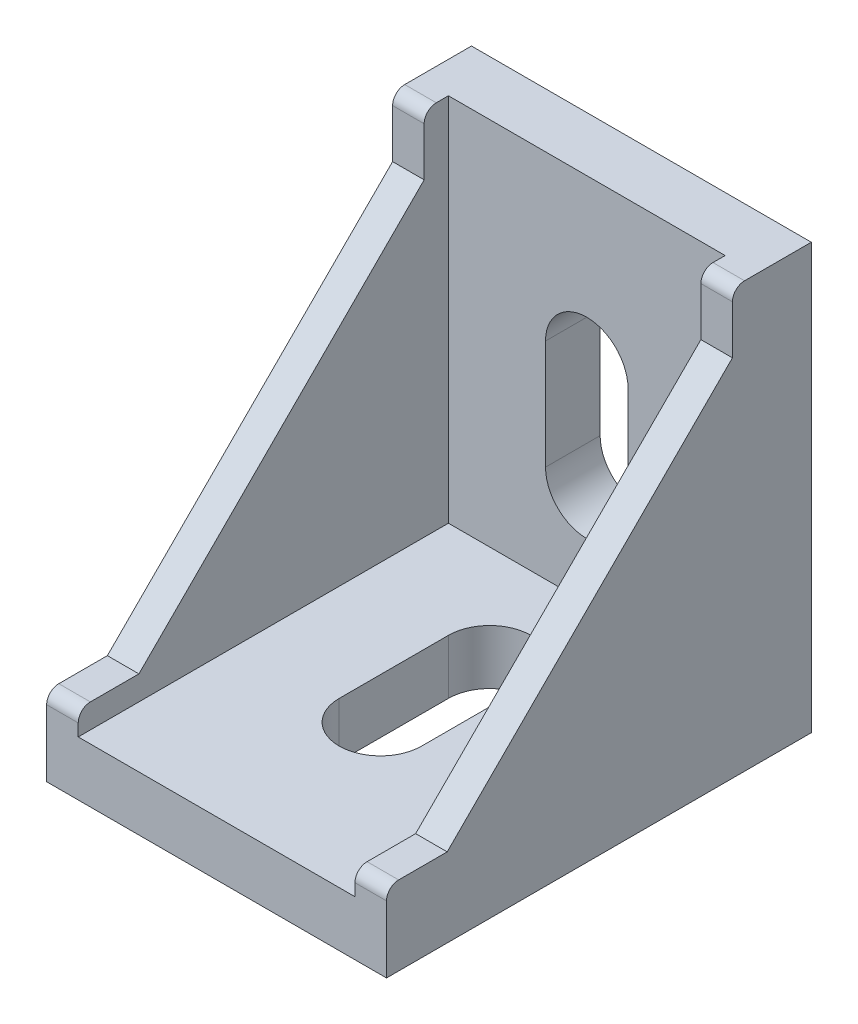
ISO-10303-21;
HEADER;
FILE_DESCRIPTION(('STEP AP214'),'2;1');
FILE_NAME('part.step','',(''),(''),'','','');
FILE_SCHEMA(('AUTOMOTIVE_DESIGN { 1 0 10303 214 1 1 1 1 }'));
ENDSEC;
DATA;
#1=APPLICATION_CONTEXT('core data for automotive mechanical design processes');
#2=APPLICATION_PROTOCOL_DEFINITION('international standard','automotive_design',2000,#1);
#3=PRODUCT_CONTEXT('',#1,'mechanical');
#4=PRODUCT('Part','Part','',(#3));
#5=PRODUCT_RELATED_PRODUCT_CATEGORY('part','',(#4));
#6=PRODUCT_DEFINITION_FORMATION('','',#4);
#7=PRODUCT_DEFINITION_CONTEXT('part definition',#1,'design');
#8=PRODUCT_DEFINITION('design','',#6,#7);
#9=PRODUCT_DEFINITION_SHAPE('','',#8);
#10=(LENGTH_UNIT() NAMED_UNIT(*) SI_UNIT(.MILLI.,.METRE.));
#11=(NAMED_UNIT(*) PLANE_ANGLE_UNIT() SI_UNIT($,.RADIAN.));
#12=(NAMED_UNIT(*) SI_UNIT($,.STERADIAN.) SOLID_ANGLE_UNIT());
#13=UNCERTAINTY_MEASURE_WITH_UNIT(LENGTH_MEASURE(1.E-05),#10,'distance_accuracy_value','');
#14=(GEOMETRIC_REPRESENTATION_CONTEXT(3) GLOBAL_UNCERTAINTY_ASSIGNED_CONTEXT((#13)) GLOBAL_UNIT_ASSIGNED_CONTEXT((#10,
#11,#12)) REPRESENTATION_CONTEXT('',''));
#15=CARTESIAN_POINT('',(0.,0.,0.));
#16=DIRECTION('',(0.,0.,1.));
#17=DIRECTION('',(1.,0.,0.));
#18=AXIS2_PLACEMENT_3D('',#15,#16,#17);
#19=CARTESIAN_POINT('',(14.,17.5,4.5));
#20=DIRECTION('',(0.,0.,-1.));
#21=DIRECTION('',(-1.,0.,0.));
#22=AXIS2_PLACEMENT_3D('',#19,#20,#21);
#23=PLANE('',#22);
#24=DIRECTION('',(0.,1.,0.));
#25=VECTOR('',#24,1.);
#26=CARTESIAN_POINT('',(3.4,-5.,4.5));
#27=LINE('',#26,#25);
#28=CARTESIAN_POINT('',(3.4,-5.,4.5));
#29=VERTEX_POINT('',#28);
#30=CARTESIAN_POINT('',(3.4,4.,4.5));
#31=VERTEX_POINT('',#30);
#32=EDGE_CURVE('E268',#29,#31,#27,.T.);
#33=ORIENTED_EDGE('',*,*,#32,.F.);
#34=CARTESIAN_POINT('',(0.,-5.,4.5));
#35=DIRECTION('',(0.,0.,1.));
#36=DIRECTION('',(1.,0.,0.));
#37=AXIS2_PLACEMENT_3D('',#34,#35,#36);
#38=CIRCLE('',#37,3.4);
#39=CARTESIAN_POINT('',(-3.4,-5.,4.5));
#40=VERTEX_POINT('',#39);
#41=EDGE_CURVE('E249',#40,#29,#38,.T.);
#42=ORIENTED_EDGE('',*,*,#41,.F.);
#43=DIRECTION('',(0.,-1.,0.));
#44=VECTOR('',#43,1.);
#45=CARTESIAN_POINT('',(-3.4,-5.,4.5));
#46=LINE('',#45,#44);
#47=CARTESIAN_POINT('',(-3.4,4.,4.5));
#48=VERTEX_POINT('',#47);
#49=EDGE_CURVE('E257',#48,#40,#46,.T.);
#50=ORIENTED_EDGE('',*,*,#49,.F.);
#51=CARTESIAN_POINT('',(0.,4.,4.5));
#52=DIRECTION('',(0.,0.,1.));
#53=DIRECTION('',(1.,0.,0.));
#54=AXIS2_PLACEMENT_3D('',#51,#52,#53);
#55=CIRCLE('',#54,3.4);
#56=EDGE_CURVE('E271',#31,#48,#55,.T.);
#57=ORIENTED_EDGE('',*,*,#56,.F.);
#58=EDGE_LOOP('',(#33,#42,#50,#57));
#59=FACE_BOUND('',#58,.T.);
#60=DIRECTION('',(0.,-1.,0.));
#61=VECTOR('',#60,1.);
#62=CARTESIAN_POINT('',(11.4,17.5,4.5));
#63=LINE('',#62,#61);
#64=CARTESIAN_POINT('',(11.4,17.5,4.5));
#65=VERTEX_POINT('',#64);
#66=CARTESIAN_POINT('',(11.4,-13.,4.5));
#67=VERTEX_POINT('',#66);
#68=EDGE_CURVE('E285',#65,#67,#63,.T.);
#69=ORIENTED_EDGE('',*,*,#68,.F.);
#70=DIRECTION('',(-1.,0.,0.));
#71=VECTOR('',#70,1.);
#72=CARTESIAN_POINT('',(-14.,17.5,4.5));
#73=LINE('',#72,#71);
#74=CARTESIAN_POINT('',(-11.4,17.5,4.5));
#75=VERTEX_POINT('',#74);
#76=EDGE_CURVE('E357',#65,#75,#73,.T.);
#77=ORIENTED_EDGE('',*,*,#76,.T.);
#78=DIRECTION('',(0.,-1.,0.));
#79=VECTOR('',#78,1.);
#80=CARTESIAN_POINT('',(-11.4,17.5,4.5));
#81=LINE('',#80,#79);
#82=CARTESIAN_POINT('',(-11.4,-13.,4.5));
#83=VERTEX_POINT('',#82);
#84=EDGE_CURVE('E313',#75,#83,#81,.T.);
#85=ORIENTED_EDGE('',*,*,#84,.T.);
#86=DIRECTION('',(1.,0.,0.));
#87=VECTOR('',#86,1.);
#88=CARTESIAN_POINT('',(14.,-13.,4.5));
#89=LINE('',#88,#87);
#90=EDGE_CURVE('E352',#83,#67,#89,.T.);
#91=ORIENTED_EDGE('',*,*,#90,.T.);
#92=EDGE_LOOP('',(#69,#77,#85,#91));
#93=FACE_BOUND('',#92,.T.);
#94=ADVANCED_FACE('F35',(#59,#93),#23,.F.);
#95=CARTESIAN_POINT('',(-14.,-13.,35.));
#96=DIRECTION('',(0.,1.,0.));
#97=DIRECTION('',(0.,0.,1.));
#98=AXIS2_PLACEMENT_3D('',#95,#96,#97);
#99=PLANE('',#98);
#100=CARTESIAN_POINT('',(0.,-13.,12.5));
#101=DIRECTION('',(0.,1.,0.));
#102=DIRECTION('',(0.,0.,1.));
#103=AXIS2_PLACEMENT_3D('',#100,#101,#102);
#104=CIRCLE('',#103,3.4);
#105=CARTESIAN_POINT('',(3.4,-13.,12.5));
#106=VERTEX_POINT('',#105);
#107=CARTESIAN_POINT('',(-3.4,-13.,12.5));
#108=VERTEX_POINT('',#107);
#109=EDGE_CURVE('E216',#106,#108,#104,.T.);
#110=ORIENTED_EDGE('',*,*,#109,.F.);
#111=DIRECTION('',(0.,0.,-1.));
#112=VECTOR('',#111,1.);
#113=CARTESIAN_POINT('',(3.4,-13.,12.5));
#114=LINE('',#113,#112);
#115=CARTESIAN_POINT('',(3.4,-13.,21.5));
#116=VERTEX_POINT('',#115);
#117=EDGE_CURVE('E234',#116,#106,#114,.T.);
#118=ORIENTED_EDGE('',*,*,#117,.F.);
#119=CARTESIAN_POINT('',(0.,-13.,21.5));
#120=DIRECTION('',(0.,1.,0.));
#121=DIRECTION('',(0.,0.,1.));
#122=AXIS2_PLACEMENT_3D('',#119,#120,#121);
#123=CIRCLE('',#122,3.4);
#124=CARTESIAN_POINT('',(-3.4,-13.,21.5));
#125=VERTEX_POINT('',#124);
#126=EDGE_CURVE('E237',#125,#116,#123,.T.);
#127=ORIENTED_EDGE('',*,*,#126,.F.);
#128=DIRECTION('',(0.,0.,1.));
#129=VECTOR('',#128,1.);
#130=CARTESIAN_POINT('',(-3.4,-13.,12.5));
#131=LINE('',#130,#129);
#132=EDGE_CURVE('E243',#108,#125,#131,.T.);
#133=ORIENTED_EDGE('',*,*,#132,.F.);
#134=EDGE_LOOP('',(#110,#118,#127,#133));
#135=FACE_BOUND('',#134,.T.);
#136=DIRECTION('',(-1.,0.,0.));
#137=VECTOR('',#136,1.);
#138=CARTESIAN_POINT('',(-14.,-13.,35.));
#139=LINE('',#138,#137);
#140=CARTESIAN_POINT('',(11.4,-13.,35.));
#141=VERTEX_POINT('',#140);
#142=CARTESIAN_POINT('',(-11.4,-13.,35.));
#143=VERTEX_POINT('',#142);
#144=EDGE_CURVE('E345',#141,#143,#139,.T.);
#145=ORIENTED_EDGE('',*,*,#144,.F.);
#146=DIRECTION('',(0.,0.,1.));
#147=VECTOR('',#146,1.);
#148=CARTESIAN_POINT('',(11.4,-13.,4.5));
#149=LINE('',#148,#147);
#150=EDGE_CURVE('E299',#67,#141,#149,.T.);
#151=ORIENTED_EDGE('',*,*,#150,.F.);
#152=ORIENTED_EDGE('',*,*,#90,.F.);
#153=DIRECTION('',(0.,0.,1.));
#154=VECTOR('',#153,1.);
#155=CARTESIAN_POINT('',(-11.4,-13.,4.5));
#156=LINE('',#155,#154);
#157=EDGE_CURVE('E316',#83,#143,#156,.T.);
#158=ORIENTED_EDGE('',*,*,#157,.T.);
#159=EDGE_LOOP('',(#145,#151,#152,#158));
#160=FACE_BOUND('',#159,.T.);
#161=ADVANCED_FACE('F483',(#135,#160),#99,.T.);
#162=CARTESIAN_POINT('',(14.,-17.5,4.5));
#163=DIRECTION('',(-1.,0.,0.));
#164=DIRECTION('',(0.,0.,1.));
#165=AXIS2_PLACEMENT_3D('',#162,#163,#164);
#166=PLANE('',#165);
#167=DIRECTION('',(0.,0.,-1.));
#168=VECTOR('',#167,1.);
#169=CARTESIAN_POINT('',(14.,-11.,30.));
#170=LINE('',#169,#168);
#171=CARTESIAN_POINT('',(14.,-11.,34.));
#172=VERTEX_POINT('',#171);
#173=CARTESIAN_POINT('',(14.,-11.,30.));
#174=VERTEX_POINT('',#173);
#175=EDGE_CURVE('E288',#172,#174,#170,.T.);
#176=ORIENTED_EDGE('',*,*,#175,.F.);
#177=CARTESIAN_POINT('',(14.,-12.,34.));
#178=DIRECTION('',(-1.,0.,0.));
#179=DIRECTION('',(0.,0.,1.));
#180=AXIS2_PLACEMENT_3D('',#177,#178,#179);
#181=CIRCLE('',#180,1.);
#182=CARTESIAN_POINT('',(14.,-12.,35.));
#183=VERTEX_POINT('',#182);
#184=EDGE_CURVE('E399',#172,#183,#181,.F.);
#185=ORIENTED_EDGE('',*,*,#184,.T.);
#186=DIRECTION('',(0.,-1.,0.));
#187=VECTOR('',#186,1.);
#188=CARTESIAN_POINT('',(14.,-13.,35.));
#189=LINE('',#188,#187);
#190=CARTESIAN_POINT('',(14.,-17.5,35.));
#191=VERTEX_POINT('',#190);
#192=EDGE_CURVE('E347',#183,#191,#189,.T.);
#193=ORIENTED_EDGE('',*,*,#192,.T.);
#194=DIRECTION('',(0.,0.,-1.));
#195=VECTOR('',#194,1.);
#196=CARTESIAN_POINT('',(14.,-17.5,4.5));
#197=LINE('',#196,#195);
#198=CARTESIAN_POINT('',(14.,-17.5,0.));
#199=VERTEX_POINT('',#198);
#200=EDGE_CURVE('E360',#191,#199,#197,.T.);
#201=ORIENTED_EDGE('',*,*,#200,.T.);
#202=DIRECTION('',(0.,1.,0.));
#203=VECTOR('',#202,1.);
#204=CARTESIAN_POINT('',(14.,-17.5,0.));
#205=LINE('',#204,#203);
#206=CARTESIAN_POINT('',(14.,17.5,0.));
#207=VERTEX_POINT('',#206);
#208=EDGE_CURVE('E356',#199,#207,#205,.T.);
#209=ORIENTED_EDGE('',*,*,#208,.T.);
#210=DIRECTION('',(0.,0.,-1.));
#211=VECTOR('',#210,1.);
#212=CARTESIAN_POINT('',(14.,17.5,4.5));
#213=LINE('',#212,#211);
#214=CARTESIAN_POINT('',(14.,17.5,5.5));
#215=VERTEX_POINT('',#214);
#216=EDGE_CURVE('E377',#215,#207,#213,.T.);
#217=ORIENTED_EDGE('',*,*,#216,.F.);
#218=CARTESIAN_POINT('',(14.,16.5,5.5));
#219=DIRECTION('',(-1.,0.,0.));
#220=DIRECTION('',(0.,0.,1.));
#221=AXIS2_PLACEMENT_3D('',#218,#219,#220);
#222=CIRCLE('',#221,1.);
#223=CARTESIAN_POINT('',(14.,16.5,6.5));
#224=VERTEX_POINT('',#223);
#225=EDGE_CURVE('E397',#215,#224,#222,.F.);
#226=ORIENTED_EDGE('',*,*,#225,.T.);
#227=DIRECTION('',(0.,1.,0.));
#228=VECTOR('',#227,1.);
#229=CARTESIAN_POINT('',(14.,17.5,6.5));
#230=LINE('',#229,#228);
#231=CARTESIAN_POINT('',(14.,12.5,6.5));
#232=VERTEX_POINT('',#231);
#233=EDGE_CURVE('E278',#232,#224,#230,.T.);
#234=ORIENTED_EDGE('',*,*,#233,.F.);
#235=DIRECTION('',(0.,0.707106781186547,-0.707106781186548));
#236=VECTOR('',#235,1.);
#237=CARTESIAN_POINT('',(14.,12.5,6.5));
#238=LINE('',#237,#236);
#239=EDGE_CURVE('E304',#174,#232,#238,.T.);
#240=ORIENTED_EDGE('',*,*,#239,.F.);
#241=EDGE_LOOP('',(#176,#185,#193,#201,#209,#217,#226,#234,#240));
#242=FACE_BOUND('',#241,.T.);
#243=ADVANCED_FACE('F416',(#242),#166,.F.);
#244=CARTESIAN_POINT('',(-14.,17.5,4.5));
#245=DIRECTION('',(0.,-1.,0.));
#246=DIRECTION('',(0.,0.,-1.));
#247=AXIS2_PLACEMENT_3D('',#244,#245,#246);
#248=PLANE('',#247);
#249=DIRECTION('',(0.,0.,-1.));
#250=VECTOR('',#249,1.);
#251=CARTESIAN_POINT('',(11.4,17.5,4.5));
#252=LINE('',#251,#250);
#253=CARTESIAN_POINT('',(11.4,17.5,5.5));
#254=VERTEX_POINT('',#253);
#255=EDGE_CURVE('E287',#254,#65,#252,.T.);
#256=ORIENTED_EDGE('',*,*,#255,.F.);
#257=DIRECTION('',(1.,0.,0.));
#258=VECTOR('',#257,1.);
#259=CARTESIAN_POINT('',(-14.,17.5,5.5));
#260=LINE('',#259,#258);
#261=EDGE_CURVE('E406',#254,#215,#260,.T.);
#262=ORIENTED_EDGE('',*,*,#261,.T.);
#263=ORIENTED_EDGE('',*,*,#216,.T.);
#264=DIRECTION('',(-1.,0.,0.));
#265=VECTOR('',#264,1.);
#266=CARTESIAN_POINT('',(-14.,17.5,0.));
#267=LINE('',#266,#265);
#268=CARTESIAN_POINT('',(-14.,17.5,0.));
#269=VERTEX_POINT('',#268);
#270=EDGE_CURVE('E364',#207,#269,#267,.T.);
#271=ORIENTED_EDGE('',*,*,#270,.T.);
#272=DIRECTION('',(0.,0.,-1.));
#273=VECTOR('',#272,1.);
#274=CARTESIAN_POINT('',(-14.,17.5,4.5));
#275=LINE('',#274,#273);
#276=CARTESIAN_POINT('',(-14.,17.5,5.5));
#277=VERTEX_POINT('',#276);
#278=EDGE_CURVE('E375',#277,#269,#275,.T.);
#279=ORIENTED_EDGE('',*,*,#278,.F.);
#280=DIRECTION('',(-1.,0.,0.));
#281=VECTOR('',#280,1.);
#282=CARTESIAN_POINT('',(-11.4,17.5,5.5));
#283=LINE('',#282,#281);
#284=CARTESIAN_POINT('',(-11.4,17.5,5.5));
#285=VERTEX_POINT('',#284);
#286=EDGE_CURVE('E404',#277,#285,#283,.F.);
#287=ORIENTED_EDGE('',*,*,#286,.T.);
#288=DIRECTION('',(0.,0.,-1.));
#289=VECTOR('',#288,1.);
#290=CARTESIAN_POINT('',(-11.4,17.5,4.5));
#291=LINE('',#290,#289);
#292=EDGE_CURVE('E331',#285,#75,#291,.T.);
#293=ORIENTED_EDGE('',*,*,#292,.T.);
#294=ORIENTED_EDGE('',*,*,#76,.F.);
#295=EDGE_LOOP('',(#256,#262,#263,#271,#279,#287,#293,#294));
#296=FACE_BOUND('',#295,.T.);
#297=ADVANCED_FACE('F411',(#296),#248,.F.);
#298=CARTESIAN_POINT('',(-14.,-17.5,4.5));
#299=DIRECTION('',(1.,0.,0.));
#300=DIRECTION('',(0.,0.,-1.));
#301=AXIS2_PLACEMENT_3D('',#298,#299,#300);
#302=PLANE('',#301);
#303=DIRECTION('',(0.,-1.,0.));
#304=VECTOR('',#303,1.);
#305=CARTESIAN_POINT('',(-14.,-13.,35.));
#306=LINE('',#305,#304);
#307=CARTESIAN_POINT('',(-14.,-12.,35.));
#308=VERTEX_POINT('',#307);
#309=CARTESIAN_POINT('',(-14.,-17.5,35.));
#310=VERTEX_POINT('',#309);
#311=EDGE_CURVE('E350',#308,#310,#306,.T.);
#312=ORIENTED_EDGE('',*,*,#311,.F.);
#313=CARTESIAN_POINT('',(-14.,-12.,34.));
#314=DIRECTION('',(1.,0.,0.));
#315=DIRECTION('',(0.,0.,-1.));
#316=AXIS2_PLACEMENT_3D('',#313,#314,#315);
#317=CIRCLE('',#316,1.);
#318=CARTESIAN_POINT('',(-14.,-11.,34.));
#319=VERTEX_POINT('',#318);
#320=EDGE_CURVE('E386',#308,#319,#317,.F.);
#321=ORIENTED_EDGE('',*,*,#320,.T.);
#322=DIRECTION('',(0.,0.,-1.));
#323=VECTOR('',#322,1.);
#324=CARTESIAN_POINT('',(-14.,-11.,30.));
#325=LINE('',#324,#323);
#326=CARTESIAN_POINT('',(-14.,-11.,30.));
#327=VERTEX_POINT('',#326);
#328=EDGE_CURVE('E310',#319,#327,#325,.T.);
#329=ORIENTED_EDGE('',*,*,#328,.T.);
#330=DIRECTION('',(0.,0.707106781186547,-0.707106781186548));
#331=VECTOR('',#330,1.);
#332=CARTESIAN_POINT('',(-14.,12.5,6.5));
#333=LINE('',#332,#331);
#334=CARTESIAN_POINT('',(-14.,12.5,6.5));
#335=VERTEX_POINT('',#334);
#336=EDGE_CURVE('E335',#327,#335,#333,.T.);
#337=ORIENTED_EDGE('',*,*,#336,.T.);
#338=DIRECTION('',(0.,1.,0.));
#339=VECTOR('',#338,1.);
#340=CARTESIAN_POINT('',(-14.,17.5,6.5));
#341=LINE('',#340,#339);
#342=CARTESIAN_POINT('',(-14.,16.5,6.5));
#343=VERTEX_POINT('',#342);
#344=EDGE_CURVE('E317',#335,#343,#341,.T.);
#345=ORIENTED_EDGE('',*,*,#344,.T.);
#346=CARTESIAN_POINT('',(-14.,16.5,5.5));
#347=DIRECTION('',(1.,0.,0.));
#348=DIRECTION('',(0.,0.,-1.));
#349=AXIS2_PLACEMENT_3D('',#346,#347,#348);
#350=CIRCLE('',#349,1.);
#351=EDGE_CURVE('E384',#343,#277,#350,.F.);
#352=ORIENTED_EDGE('',*,*,#351,.T.);
#353=ORIENTED_EDGE('',*,*,#278,.T.);
#354=DIRECTION('',(0.,-1.,0.));
#355=VECTOR('',#354,1.);
#356=CARTESIAN_POINT('',(-14.,-17.5,0.));
#357=LINE('',#356,#355);
#358=CARTESIAN_POINT('',(-14.,-17.5,0.));
#359=VERTEX_POINT('',#358);
#360=EDGE_CURVE('E367',#269,#359,#357,.T.);
#361=ORIENTED_EDGE('',*,*,#360,.T.);
#362=DIRECTION('',(0.,0.,-1.));
#363=VECTOR('',#362,1.);
#364=CARTESIAN_POINT('',(-14.,-17.5,4.5));
#365=LINE('',#364,#363);
#366=EDGE_CURVE('E372',#310,#359,#365,.T.);
#367=ORIENTED_EDGE('',*,*,#366,.F.);
#368=EDGE_LOOP('',(#312,#321,#329,#337,#345,#352,#353,#361,#367));
#369=FACE_BOUND('',#368,.T.);
#370=ADVANCED_FACE('F457',(#369),#302,.F.);
#371=CARTESIAN_POINT('',(-14.,-17.5,4.5));
#372=DIRECTION('',(0.,1.,0.));
#373=DIRECTION('',(0.,0.,1.));
#374=AXIS2_PLACEMENT_3D('',#371,#372,#373);
#375=PLANE('',#374);
#376=DIRECTION('',(0.,0.,-1.));
#377=VECTOR('',#376,1.);
#378=CARTESIAN_POINT('',(3.4,-17.5,12.5));
#379=LINE('',#378,#377);
#380=CARTESIAN_POINT('',(3.4,-17.5,21.5));
#381=VERTEX_POINT('',#380);
#382=CARTESIAN_POINT('',(3.4,-17.5,12.5));
#383=VERTEX_POINT('',#382);
#384=EDGE_CURVE('E221',#381,#383,#379,.T.);
#385=ORIENTED_EDGE('',*,*,#384,.T.);
#386=CARTESIAN_POINT('',(0.,-17.5,12.5));
#387=DIRECTION('',(0.,1.,0.));
#388=DIRECTION('',(0.,0.,1.));
#389=AXIS2_PLACEMENT_3D('',#386,#387,#388);
#390=CIRCLE('',#389,3.4);
#391=CARTESIAN_POINT('',(-3.4,-17.5,12.5));
#392=VERTEX_POINT('',#391);
#393=EDGE_CURVE('E213',#383,#392,#390,.T.);
#394=ORIENTED_EDGE('',*,*,#393,.T.);
#395=DIRECTION('',(0.,0.,1.));
#396=VECTOR('',#395,1.);
#397=CARTESIAN_POINT('',(-3.4,-17.5,12.5));
#398=LINE('',#397,#396);
#399=CARTESIAN_POINT('',(-3.4,-17.5,21.5));
#400=VERTEX_POINT('',#399);
#401=EDGE_CURVE('E225',#392,#400,#398,.T.);
#402=ORIENTED_EDGE('',*,*,#401,.T.);
#403=CARTESIAN_POINT('',(0.,-17.5,21.5));
#404=DIRECTION('',(0.,1.,0.));
#405=DIRECTION('',(0.,0.,1.));
#406=AXIS2_PLACEMENT_3D('',#403,#404,#405);
#407=CIRCLE('',#406,3.4);
#408=EDGE_CURVE('E229',#400,#381,#407,.T.);
#409=ORIENTED_EDGE('',*,*,#408,.T.);
#410=EDGE_LOOP('',(#385,#394,#402,#409));
#411=FACE_BOUND('',#410,.T.);
#412=DIRECTION('',(1.,0.,0.));
#413=VECTOR('',#412,1.);
#414=CARTESIAN_POINT('',(-14.,-17.5,0.));
#415=LINE('',#414,#413);
#416=EDGE_CURVE('E361',#359,#199,#415,.T.);
#417=ORIENTED_EDGE('',*,*,#416,.T.);
#418=ORIENTED_EDGE('',*,*,#200,.F.);
#419=DIRECTION('',(-1.,0.,0.));
#420=VECTOR('',#419,1.);
#421=CARTESIAN_POINT('',(-14.,-17.5,35.));
#422=LINE('',#421,#420);
#423=EDGE_CURVE('E342',#191,#310,#422,.T.);
#424=ORIENTED_EDGE('',*,*,#423,.T.);
#425=ORIENTED_EDGE('',*,*,#366,.T.);
#426=EDGE_LOOP('',(#417,#418,#424,#425));
#427=FACE_BOUND('',#426,.T.);
#428=ADVANCED_FACE('F231',(#411,#427),#375,.F.);
#429=CARTESIAN_POINT('',(14.,17.5,0.));
#430=DIRECTION('',(0.,0.,-1.));
#431=DIRECTION('',(-1.,0.,0.));
#432=AXIS2_PLACEMENT_3D('',#429,#430,#431);
#433=PLANE('',#432);
#434=CARTESIAN_POINT('',(0.,-5.,0.));
#435=DIRECTION('',(0.,0.,1.));
#436=DIRECTION('',(1.,0.,0.));
#437=AXIS2_PLACEMENT_3D('',#434,#435,#436);
#438=CIRCLE('',#437,3.4);
#439=CARTESIAN_POINT('',(-3.4,-5.,0.));
#440=VERTEX_POINT('',#439);
#441=CARTESIAN_POINT('',(3.4,-5.,0.));
#442=VERTEX_POINT('',#441);
#443=EDGE_CURVE('E253',#440,#442,#438,.T.);
#444=ORIENTED_EDGE('',*,*,#443,.T.);
#445=DIRECTION('',(0.,1.,0.));
#446=VECTOR('',#445,1.);
#447=CARTESIAN_POINT('',(3.4,-5.,0.));
#448=LINE('',#447,#446);
#449=CARTESIAN_POINT('',(3.4,4.,0.));
#450=VERTEX_POINT('',#449);
#451=EDGE_CURVE('E256',#442,#450,#448,.T.);
#452=ORIENTED_EDGE('',*,*,#451,.T.);
#453=CARTESIAN_POINT('',(0.,4.,0.));
#454=DIRECTION('',(0.,0.,1.));
#455=DIRECTION('',(1.,0.,0.));
#456=AXIS2_PLACEMENT_3D('',#453,#454,#455);
#457=CIRCLE('',#456,3.4);
#458=CARTESIAN_POINT('',(-3.4,4.,0.));
#459=VERTEX_POINT('',#458);
#460=EDGE_CURVE('E260',#450,#459,#457,.T.);
#461=ORIENTED_EDGE('',*,*,#460,.T.);
#462=DIRECTION('',(0.,-1.,0.));
#463=VECTOR('',#462,1.);
#464=CARTESIAN_POINT('',(-3.4,-5.,0.));
#465=LINE('',#464,#463);
#466=EDGE_CURVE('E263',#459,#440,#465,.T.);
#467=ORIENTED_EDGE('',*,*,#466,.T.);
#468=EDGE_LOOP('',(#444,#452,#461,#467));
#469=FACE_BOUND('',#468,.T.);
#470=ORIENTED_EDGE('',*,*,#270,.F.);
#471=ORIENTED_EDGE('',*,*,#208,.F.);
#472=ORIENTED_EDGE('',*,*,#416,.F.);
#473=ORIENTED_EDGE('',*,*,#360,.F.);
#474=EDGE_LOOP('',(#470,#471,#472,#473));
#475=FACE_BOUND('',#474,.T.);
#476=ADVANCED_FACE('F424',(#469,#475),#433,.T.);
#477=CARTESIAN_POINT('',(-14.,-13.,35.));
#478=DIRECTION('',(0.,0.,1.));
#479=DIRECTION('',(1.,0.,0.));
#480=AXIS2_PLACEMENT_3D('',#477,#478,#479);
#481=PLANE('',#480);
#482=DIRECTION('',(0.,1.,0.));
#483=VECTOR('',#482,1.);
#484=CARTESIAN_POINT('',(-11.4,-11.,35.));
#485=LINE('',#484,#483);
#486=CARTESIAN_POINT('',(-11.4,-12.,35.));
#487=VERTEX_POINT('',#486);
#488=EDGE_CURVE('E320',#143,#487,#485,.T.);
#489=ORIENTED_EDGE('',*,*,#488,.T.);
#490=DIRECTION('',(-1.,0.,0.));
#491=VECTOR('',#490,1.);
#492=CARTESIAN_POINT('',(-14.,-12.,35.));
#493=LINE('',#492,#491);
#494=EDGE_CURVE('E381',#487,#308,#493,.T.);
#495=ORIENTED_EDGE('',*,*,#494,.T.);
#496=ORIENTED_EDGE('',*,*,#311,.T.);
#497=ORIENTED_EDGE('',*,*,#423,.F.);
#498=ORIENTED_EDGE('',*,*,#192,.F.);
#499=DIRECTION('',(1.,0.,0.));
#500=VECTOR('',#499,1.);
#501=CARTESIAN_POINT('',(11.4,-12.,35.));
#502=LINE('',#501,#500);
#503=CARTESIAN_POINT('',(11.4,-12.,35.));
#504=VERTEX_POINT('',#503);
#505=EDGE_CURVE('E379',#183,#504,#502,.F.);
#506=ORIENTED_EDGE('',*,*,#505,.T.);
#507=DIRECTION('',(0.,1.,0.));
#508=VECTOR('',#507,1.);
#509=CARTESIAN_POINT('',(11.4,-11.,35.));
#510=LINE('',#509,#508);
#511=EDGE_CURVE('E296',#141,#504,#510,.T.);
#512=ORIENTED_EDGE('',*,*,#511,.F.);
#513=ORIENTED_EDGE('',*,*,#144,.T.);
#514=EDGE_LOOP('',(#489,#495,#496,#497,#498,#506,#512,#513));
#515=FACE_BOUND('',#514,.T.);
#516=ADVANCED_FACE('F454',(#515),#481,.T.);
#517=CARTESIAN_POINT('',(-11.4,17.5,6.5));
#518=DIRECTION('',(0.,0.,1.));
#519=DIRECTION('',(1.,0.,0.));
#520=AXIS2_PLACEMENT_3D('',#517,#518,#519);
#521=PLANE('',#520);
#522=DIRECTION('',(0.,1.,0.));
#523=VECTOR('',#522,1.);
#524=CARTESIAN_POINT('',(-11.4,17.5,6.5));
#525=LINE('',#524,#523);
#526=CARTESIAN_POINT('',(-11.4,12.5,6.5));
#527=VERTEX_POINT('',#526);
#528=CARTESIAN_POINT('',(-11.4,16.5,6.5));
#529=VERTEX_POINT('',#528);
#530=EDGE_CURVE('E328',#527,#529,#525,.T.);
#531=ORIENTED_EDGE('',*,*,#530,.T.);
#532=DIRECTION('',(-1.,0.,0.));
#533=VECTOR('',#532,1.);
#534=CARTESIAN_POINT('',(-14.,16.5,6.5));
#535=LINE('',#534,#533);
#536=EDGE_CURVE('E11',#529,#343,#535,.T.);
#537=ORIENTED_EDGE('',*,*,#536,.T.);
#538=ORIENTED_EDGE('',*,*,#344,.F.);
#539=DIRECTION('',(-1.,0.,0.));
#540=VECTOR('',#539,1.);
#541=CARTESIAN_POINT('',(-11.4,12.5,6.5));
#542=LINE('',#541,#540);
#543=EDGE_CURVE('E340',#527,#335,#542,.T.);
#544=ORIENTED_EDGE('',*,*,#543,.F.);
#545=EDGE_LOOP('',(#531,#537,#538,#544));
#546=FACE_BOUND('',#545,.T.);
#547=ADVANCED_FACE('F439',(#546),#521,.T.);
#548=CARTESIAN_POINT('',(-11.4,12.5,6.5));
#549=DIRECTION('',(0.,0.707106781186548,0.707106781186547));
#550=DIRECTION('',(0.,-0.707106781186547,0.707106781186548));
#551=AXIS2_PLACEMENT_3D('',#548,#549,#550);
#552=PLANE('',#551);
#553=ORIENTED_EDGE('',*,*,#336,.F.);
#554=DIRECTION('',(-1.,0.,0.));
#555=VECTOR('',#554,1.);
#556=CARTESIAN_POINT('',(-11.4,-11.,30.));
#557=LINE('',#556,#555);
#558=CARTESIAN_POINT('',(-11.4,-11.,30.));
#559=VERTEX_POINT('',#558);
#560=EDGE_CURVE('E333',#559,#327,#557,.T.);
#561=ORIENTED_EDGE('',*,*,#560,.F.);
#562=DIRECTION('',(0.,0.707106781186547,-0.707106781186548));
#563=VECTOR('',#562,1.);
#564=CARTESIAN_POINT('',(-11.4,12.5,6.5));
#565=LINE('',#564,#563);
#566=EDGE_CURVE('E325',#559,#527,#565,.T.);
#567=ORIENTED_EDGE('',*,*,#566,.T.);
#568=ORIENTED_EDGE('',*,*,#543,.T.);
#569=EDGE_LOOP('',(#553,#561,#567,#568));
#570=FACE_BOUND('',#569,.T.);
#571=ADVANCED_FACE('F443',(#570),#552,.T.);
#572=CARTESIAN_POINT('',(-11.4,-11.,30.));
#573=DIRECTION('',(0.,1.,0.));
#574=DIRECTION('',(0.,0.,1.));
#575=AXIS2_PLACEMENT_3D('',#572,#573,#574);
#576=PLANE('',#575);
#577=ORIENTED_EDGE('',*,*,#328,.F.);
#578=DIRECTION('',(-1.,0.,0.));
#579=VECTOR('',#578,1.);
#580=CARTESIAN_POINT('',(-11.4,-11.,34.));
#581=LINE('',#580,#579);
#582=CARTESIAN_POINT('',(-11.4,-11.,34.));
#583=VERTEX_POINT('',#582);
#584=EDGE_CURVE('E388',#319,#583,#581,.F.);
#585=ORIENTED_EDGE('',*,*,#584,.T.);
#586=DIRECTION('',(0.,0.,-1.));
#587=VECTOR('',#586,1.);
#588=CARTESIAN_POINT('',(-11.4,-11.,30.));
#589=LINE('',#588,#587);
#590=EDGE_CURVE('E323',#583,#559,#589,.T.);
#591=ORIENTED_EDGE('',*,*,#590,.T.);
#592=ORIENTED_EDGE('',*,*,#560,.T.);
#593=EDGE_LOOP('',(#577,#585,#591,#592));
#594=FACE_BOUND('',#593,.T.);
#595=ADVANCED_FACE('F549',(#594),#576,.T.);
#596=CARTESIAN_POINT('',(-11.4,-13.,4.5));
#597=DIRECTION('',(-1.,0.,0.));
#598=DIRECTION('',(0.,0.,1.));
#599=AXIS2_PLACEMENT_3D('',#596,#597,#598);
#600=PLANE('',#599);
#601=ORIENTED_EDGE('',*,*,#590,.F.);
#602=CARTESIAN_POINT('',(-11.4,-12.,34.));
#603=DIRECTION('',(-1.,0.,0.));
#604=DIRECTION('',(0.,0.,1.));
#605=AXIS2_PLACEMENT_3D('',#602,#603,#604);
#606=CIRCLE('',#605,1.);
#607=EDGE_CURVE('E392',#583,#487,#606,.F.);
#608=ORIENTED_EDGE('',*,*,#607,.T.);
#609=ORIENTED_EDGE('',*,*,#488,.F.);
#610=ORIENTED_EDGE('',*,*,#157,.F.);
#611=ORIENTED_EDGE('',*,*,#84,.F.);
#612=ORIENTED_EDGE('',*,*,#292,.F.);
#613=CARTESIAN_POINT('',(-11.4,16.5,5.5));
#614=DIRECTION('',(-1.,0.,0.));
#615=DIRECTION('',(0.,0.,1.));
#616=AXIS2_PLACEMENT_3D('',#613,#614,#615);
#617=CIRCLE('',#616,1.);
#618=EDGE_CURVE('E390',#285,#529,#617,.F.);
#619=ORIENTED_EDGE('',*,*,#618,.T.);
#620=ORIENTED_EDGE('',*,*,#530,.F.);
#621=ORIENTED_EDGE('',*,*,#566,.F.);
#622=EDGE_LOOP('',(#601,#608,#609,#610,#611,#612,#619,#620,#621));
#623=FACE_BOUND('',#622,.T.);
#624=ADVANCED_FACE('F435',(#623),#600,.F.);
#625=CARTESIAN_POINT('',(11.4,-11.,30.));
#626=DIRECTION('',(0.,-1.,0.));
#627=DIRECTION('',(0.,0.,-1.));
#628=AXIS2_PLACEMENT_3D('',#625,#626,#627);
#629=PLANE('',#628);
#630=DIRECTION('',(0.,0.,-1.));
#631=VECTOR('',#630,1.);
#632=CARTESIAN_POINT('',(11.4,-11.,30.));
#633=LINE('',#632,#631);
#634=CARTESIAN_POINT('',(11.4,-11.,34.));
#635=VERTEX_POINT('',#634);
#636=CARTESIAN_POINT('',(11.4,-11.,30.));
#637=VERTEX_POINT('',#636);
#638=EDGE_CURVE('E294',#635,#637,#633,.T.);
#639=ORIENTED_EDGE('',*,*,#638,.F.);
#640=DIRECTION('',(1.,0.,0.));
#641=VECTOR('',#640,1.);
#642=CARTESIAN_POINT('',(14.,-11.,34.));
#643=LINE('',#642,#641);
#644=EDGE_CURVE('E394',#635,#172,#643,.T.);
#645=ORIENTED_EDGE('',*,*,#644,.T.);
#646=ORIENTED_EDGE('',*,*,#175,.T.);
#647=DIRECTION('',(1.,0.,0.));
#648=VECTOR('',#647,1.);
#649=CARTESIAN_POINT('',(11.4,-11.,30.));
#650=LINE('',#649,#648);
#651=EDGE_CURVE('E307',#637,#174,#650,.T.);
#652=ORIENTED_EDGE('',*,*,#651,.F.);
#653=EDGE_LOOP('',(#639,#645,#646,#652));
#654=FACE_BOUND('',#653,.T.);
#655=ADVANCED_FACE('F469',(#654),#629,.F.);
#656=CARTESIAN_POINT('',(11.4,12.5,6.5));
#657=DIRECTION('',(0.,-0.707106781186548,-0.707106781186547));
#658=DIRECTION('',(0.,0.707106781186547,-0.707106781186548));
#659=AXIS2_PLACEMENT_3D('',#656,#657,#658);
#660=PLANE('',#659);
#661=ORIENTED_EDGE('',*,*,#239,.T.);
#662=DIRECTION('',(1.,0.,0.));
#663=VECTOR('',#662,1.);
#664=CARTESIAN_POINT('',(11.4,12.5,6.5));
#665=LINE('',#664,#663);
#666=CARTESIAN_POINT('',(11.4,12.5,6.5));
#667=VERTEX_POINT('',#666);
#668=EDGE_CURVE('E302',#667,#232,#665,.T.);
#669=ORIENTED_EDGE('',*,*,#668,.F.);
#670=DIRECTION('',(0.,0.707106781186547,-0.707106781186548));
#671=VECTOR('',#670,1.);
#672=CARTESIAN_POINT('',(11.4,12.5,6.5));
#673=LINE('',#672,#671);
#674=EDGE_CURVE('E292',#637,#667,#673,.T.);
#675=ORIENTED_EDGE('',*,*,#674,.F.);
#676=ORIENTED_EDGE('',*,*,#651,.T.);
#677=EDGE_LOOP('',(#661,#669,#675,#676));
#678=FACE_BOUND('',#677,.T.);
#679=ADVANCED_FACE('F474',(#678),#660,.F.);
#680=CARTESIAN_POINT('',(11.4,17.5,6.5));
#681=DIRECTION('',(0.,0.,-1.));
#682=DIRECTION('',(-1.,0.,0.));
#683=AXIS2_PLACEMENT_3D('',#680,#681,#682);
#684=PLANE('',#683);
#685=ORIENTED_EDGE('',*,*,#233,.T.);
#686=DIRECTION('',(1.,0.,0.));
#687=VECTOR('',#686,1.);
#688=CARTESIAN_POINT('',(11.4,16.5,6.5));
#689=LINE('',#688,#687);
#690=CARTESIAN_POINT('',(11.4,16.5,6.5));
#691=VERTEX_POINT('',#690);
#692=EDGE_CURVE('E43',#224,#691,#689,.F.);
#693=ORIENTED_EDGE('',*,*,#692,.T.);
#694=DIRECTION('',(0.,1.,0.));
#695=VECTOR('',#694,1.);
#696=CARTESIAN_POINT('',(11.4,17.5,6.5));
#697=LINE('',#696,#695);
#698=EDGE_CURVE('E290',#667,#691,#697,.T.);
#699=ORIENTED_EDGE('',*,*,#698,.F.);
#700=ORIENTED_EDGE('',*,*,#668,.T.);
#701=EDGE_LOOP('',(#685,#693,#699,#700));
#702=FACE_BOUND('',#701,.T.);
#703=ADVANCED_FACE('F540',(#702),#684,.F.);
#704=CARTESIAN_POINT('',(11.4,-13.,4.5));
#705=DIRECTION('',(1.,0.,0.));
#706=DIRECTION('',(0.,0.,1.));
#707=AXIS2_PLACEMENT_3D('',#704,#705,#706);
#708=PLANE('',#707);
#709=ORIENTED_EDGE('',*,*,#511,.T.);
#710=CARTESIAN_POINT('',(11.4,-12.,34.));
#711=DIRECTION('',(1.,0.,0.));
#712=DIRECTION('',(0.,0.,-1.));
#713=AXIS2_PLACEMENT_3D('',#710,#711,#712);
#714=CIRCLE('',#713,1.);
#715=EDGE_CURVE('E402',#504,#635,#714,.F.);
#716=ORIENTED_EDGE('',*,*,#715,.T.);
#717=ORIENTED_EDGE('',*,*,#638,.T.);
#718=ORIENTED_EDGE('',*,*,#674,.T.);
#719=ORIENTED_EDGE('',*,*,#698,.T.);
#720=CARTESIAN_POINT('',(11.4,16.5,5.5));
#721=DIRECTION('',(1.,0.,0.));
#722=DIRECTION('',(0.,0.,-1.));
#723=AXIS2_PLACEMENT_3D('',#720,#721,#722);
#724=CIRCLE('',#723,1.);
#725=EDGE_CURVE('E50',#691,#254,#724,.F.);
#726=ORIENTED_EDGE('',*,*,#725,.T.);
#727=ORIENTED_EDGE('',*,*,#255,.T.);
#728=ORIENTED_EDGE('',*,*,#68,.T.);
#729=ORIENTED_EDGE('',*,*,#150,.T.);
#730=EDGE_LOOP('',(#709,#716,#717,#718,#719,#726,#727,#728,#729));
#731=FACE_BOUND('',#730,.T.);
#732=ADVANCED_FACE('F466',(#731),#708,.F.);
#733=CARTESIAN_POINT('',(0.,-5.,0.));
#734=DIRECTION('',(0.,0.,1.));
#735=DIRECTION('',(1.,0.,0.));
#736=AXIS2_PLACEMENT_3D('',#733,#734,#735);
#737=CYLINDRICAL_SURFACE('',#736,3.4);
#738=ORIENTED_EDGE('',*,*,#41,.T.);
#739=DIRECTION('',(0.,0.,1.));
#740=VECTOR('',#739,1.);
#741=CARTESIAN_POINT('',(3.4,-5.,0.));
#742=LINE('',#741,#740);
#743=EDGE_CURVE('E266',#442,#29,#742,.T.);
#744=ORIENTED_EDGE('',*,*,#743,.F.);
#745=ORIENTED_EDGE('',*,*,#443,.F.);
#746=DIRECTION('',(0.,0.,1.));
#747=VECTOR('',#746,1.);
#748=CARTESIAN_POINT('',(-3.4,-5.,0.));
#749=LINE('',#748,#747);
#750=EDGE_CURVE('E276',#440,#40,#749,.T.);
#751=ORIENTED_EDGE('',*,*,#750,.T.);
#752=EDGE_LOOP('',(#738,#744,#745,#751));
#753=FACE_BOUND('',#752,.T.);
#754=ADVANCED_FACE('F527',(#753),#737,.F.);
#755=CARTESIAN_POINT('',(-3.4,-5.,0.));
#756=DIRECTION('',(-1.,0.,0.));
#757=DIRECTION('',(0.,0.,1.));
#758=AXIS2_PLACEMENT_3D('',#755,#756,#757);
#759=PLANE('',#758);
#760=ORIENTED_EDGE('',*,*,#49,.T.);
#761=ORIENTED_EDGE('',*,*,#750,.F.);
#762=ORIENTED_EDGE('',*,*,#466,.F.);
#763=DIRECTION('',(0.,0.,1.));
#764=VECTOR('',#763,1.);
#765=CARTESIAN_POINT('',(-3.4,4.,0.));
#766=LINE('',#765,#764);
#767=EDGE_CURVE('E279',#459,#48,#766,.T.);
#768=ORIENTED_EDGE('',*,*,#767,.T.);
#769=EDGE_LOOP('',(#760,#761,#762,#768));
#770=FACE_BOUND('',#769,.T.);
#771=ADVANCED_FACE('F523',(#770),#759,.F.);
#772=CARTESIAN_POINT('',(0.,4.,0.));
#773=DIRECTION('',(0.,0.,1.));
#774=DIRECTION('',(1.,0.,0.));
#775=AXIS2_PLACEMENT_3D('',#772,#773,#774);
#776=CYLINDRICAL_SURFACE('',#775,3.4);
#777=ORIENTED_EDGE('',*,*,#56,.T.);
#778=ORIENTED_EDGE('',*,*,#767,.F.);
#779=ORIENTED_EDGE('',*,*,#460,.F.);
#780=DIRECTION('',(0.,0.,1.));
#781=VECTOR('',#780,1.);
#782=CARTESIAN_POINT('',(3.4,4.,0.));
#783=LINE('',#782,#781);
#784=EDGE_CURVE('E281',#450,#31,#783,.T.);
#785=ORIENTED_EDGE('',*,*,#784,.T.);
#786=EDGE_LOOP('',(#777,#778,#779,#785));
#787=FACE_BOUND('',#786,.T.);
#788=ADVANCED_FACE('F526',(#787),#776,.F.);
#789=CARTESIAN_POINT('',(3.4,-5.,0.));
#790=DIRECTION('',(1.,0.,0.));
#791=DIRECTION('',(0.,0.,-1.));
#792=AXIS2_PLACEMENT_3D('',#789,#790,#791);
#793=PLANE('',#792);
#794=ORIENTED_EDGE('',*,*,#32,.T.);
#795=ORIENTED_EDGE('',*,*,#784,.F.);
#796=ORIENTED_EDGE('',*,*,#451,.F.);
#797=ORIENTED_EDGE('',*,*,#743,.T.);
#798=EDGE_LOOP('',(#794,#795,#796,#797));
#799=FACE_BOUND('',#798,.T.);
#800=ADVANCED_FACE('F522',(#799),#793,.F.);
#801=CARTESIAN_POINT('',(0.,-17.5,12.5));
#802=DIRECTION('',(0.,1.,0.));
#803=DIRECTION('',(0.,0.,1.));
#804=AXIS2_PLACEMENT_3D('',#801,#802,#803);
#805=CYLINDRICAL_SURFACE('',#804,3.4);
#806=ORIENTED_EDGE('',*,*,#109,.T.);
#807=DIRECTION('',(0.,1.,0.));
#808=VECTOR('',#807,1.);
#809=CARTESIAN_POINT('',(-3.4,-17.5,12.5));
#810=LINE('',#809,#808);
#811=EDGE_CURVE('E209',#392,#108,#810,.T.);
#812=ORIENTED_EDGE('',*,*,#811,.F.);
#813=ORIENTED_EDGE('',*,*,#393,.F.);
#814=DIRECTION('',(0.,1.,0.));
#815=VECTOR('',#814,1.);
#816=CARTESIAN_POINT('',(3.4,-17.5,12.5));
#817=LINE('',#816,#815);
#818=EDGE_CURVE('E247',#383,#106,#817,.T.);
#819=ORIENTED_EDGE('',*,*,#818,.T.);
#820=EDGE_LOOP('',(#806,#812,#813,#819));
#821=FACE_BOUND('',#820,.T.);
#822=ADVANCED_FACE('F211',(#821),#805,.F.);
#823=CARTESIAN_POINT('',(3.4,-17.5,12.5));
#824=DIRECTION('',(1.,0.,0.));
#825=DIRECTION('',(0.,0.,-1.));
#826=AXIS2_PLACEMENT_3D('',#823,#824,#825);
#827=PLANE('',#826);
#828=ORIENTED_EDGE('',*,*,#117,.T.);
#829=ORIENTED_EDGE('',*,*,#818,.F.);
#830=ORIENTED_EDGE('',*,*,#384,.F.);
#831=DIRECTION('',(0.,1.,0.));
#832=VECTOR('',#831,1.);
#833=CARTESIAN_POINT('',(3.4,-17.5,21.5));
#834=LINE('',#833,#832);
#835=EDGE_CURVE('E250',#381,#116,#834,.T.);
#836=ORIENTED_EDGE('',*,*,#835,.T.);
#837=EDGE_LOOP('',(#828,#829,#830,#836));
#838=FACE_BOUND('',#837,.T.);
#839=ADVANCED_FACE('F515',(#838),#827,.F.);
#840=CARTESIAN_POINT('',(0.,-17.5,21.5));
#841=DIRECTION('',(0.,1.,0.));
#842=DIRECTION('',(0.,0.,1.));
#843=AXIS2_PLACEMENT_3D('',#840,#841,#842);
#844=CYLINDRICAL_SURFACE('',#843,3.4);
#845=ORIENTED_EDGE('',*,*,#126,.T.);
#846=ORIENTED_EDGE('',*,*,#835,.F.);
#847=ORIENTED_EDGE('',*,*,#408,.F.);
#848=DIRECTION('',(0.,1.,0.));
#849=VECTOR('',#848,1.);
#850=CARTESIAN_POINT('',(-3.4,-17.5,21.5));
#851=LINE('',#850,#849);
#852=EDGE_CURVE('E220',#400,#125,#851,.T.);
#853=ORIENTED_EDGE('',*,*,#852,.T.);
#854=EDGE_LOOP('',(#845,#846,#847,#853));
#855=FACE_BOUND('',#854,.T.);
#856=ADVANCED_FACE('F510',(#855),#844,.F.);
#857=CARTESIAN_POINT('',(-3.4,-17.5,12.5));
#858=DIRECTION('',(-1.,0.,0.));
#859=DIRECTION('',(0.,0.,1.));
#860=AXIS2_PLACEMENT_3D('',#857,#858,#859);
#861=PLANE('',#860);
#862=ORIENTED_EDGE('',*,*,#132,.T.);
#863=ORIENTED_EDGE('',*,*,#852,.F.);
#864=ORIENTED_EDGE('',*,*,#401,.F.);
#865=ORIENTED_EDGE('',*,*,#811,.T.);
#866=EDGE_LOOP('',(#862,#863,#864,#865));
#867=FACE_BOUND('',#866,.T.);
#868=ADVANCED_FACE('F226',(#867),#861,.F.);
#869=CARTESIAN_POINT('',(-14.,-12.,34.));
#870=DIRECTION('',(-1.,0.,0.));
#871=DIRECTION('',(0.,0.,1.));
#872=AXIS2_PLACEMENT_3D('',#869,#870,#871);
#873=CYLINDRICAL_SURFACE('',#872,1.);
#874=ORIENTED_EDGE('',*,*,#607,.F.);
#875=ORIENTED_EDGE('',*,*,#584,.F.);
#876=ORIENTED_EDGE('',*,*,#320,.F.);
#877=ORIENTED_EDGE('',*,*,#494,.F.);
#878=EDGE_LOOP('',(#874,#875,#876,#877));
#879=FACE_BOUND('',#878,.T.);
#880=ADVANCED_FACE('F451',(#879),#873,.T.);
#881=CARTESIAN_POINT('',(11.4,-12.,34.));
#882=DIRECTION('',(-1.,0.,0.));
#883=DIRECTION('',(0.,0.,1.));
#884=AXIS2_PLACEMENT_3D('',#881,#882,#883);
#885=CYLINDRICAL_SURFACE('',#884,1.);
#886=ORIENTED_EDGE('',*,*,#715,.F.);
#887=ORIENTED_EDGE('',*,*,#505,.F.);
#888=ORIENTED_EDGE('',*,*,#184,.F.);
#889=ORIENTED_EDGE('',*,*,#644,.F.);
#890=EDGE_LOOP('',(#886,#887,#888,#889));
#891=FACE_BOUND('',#890,.T.);
#892=ADVANCED_FACE('F463',(#891),#885,.T.);
#893=CARTESIAN_POINT('',(-14.,16.5,5.5));
#894=DIRECTION('',(1.,0.,0.));
#895=DIRECTION('',(0.,0.,-1.));
#896=AXIS2_PLACEMENT_3D('',#893,#894,#895);
#897=CYLINDRICAL_SURFACE('',#896,1.);
#898=ORIENTED_EDGE('',*,*,#725,.F.);
#899=ORIENTED_EDGE('',*,*,#692,.F.);
#900=ORIENTED_EDGE('',*,*,#225,.F.);
#901=ORIENTED_EDGE('',*,*,#261,.F.);
#902=EDGE_LOOP('',(#898,#899,#900,#901));
#903=FACE_BOUND('',#902,.T.);
#904=ADVANCED_FACE('F475',(#903),#897,.T.);
#905=CARTESIAN_POINT('',(-11.4,16.5,5.5));
#906=DIRECTION('',(1.,0.,0.));
#907=DIRECTION('',(0.,0.,-1.));
#908=AXIS2_PLACEMENT_3D('',#905,#906,#907);
#909=CYLINDRICAL_SURFACE('',#908,1.);
#910=ORIENTED_EDGE('',*,*,#618,.F.);
#911=ORIENTED_EDGE('',*,*,#286,.F.);
#912=ORIENTED_EDGE('',*,*,#351,.F.);
#913=ORIENTED_EDGE('',*,*,#536,.F.);
#914=EDGE_LOOP('',(#910,#911,#912,#913));
#915=FACE_BOUND('',#914,.T.);
#916=ADVANCED_FACE('F37',(#915),#909,.T.);
#917=CLOSED_SHELL('',(#94,#161,#243,#297,#370,#428,#476,#516,#547,#571,#595,#624,#655,#679,#703,
#732,#754,#771,#788,#800,#822,#839,#856,#868,#880,#892,#904,#916));
#918=MANIFOLD_SOLID_BREP('B2',#917);
#919=ADVANCED_BREP_SHAPE_REPRESENTATION('',(#18,#918),#14);
#920=SHAPE_DEFINITION_REPRESENTATION(#9,#919);
ENDSEC;
END-ISO-10303-21;
